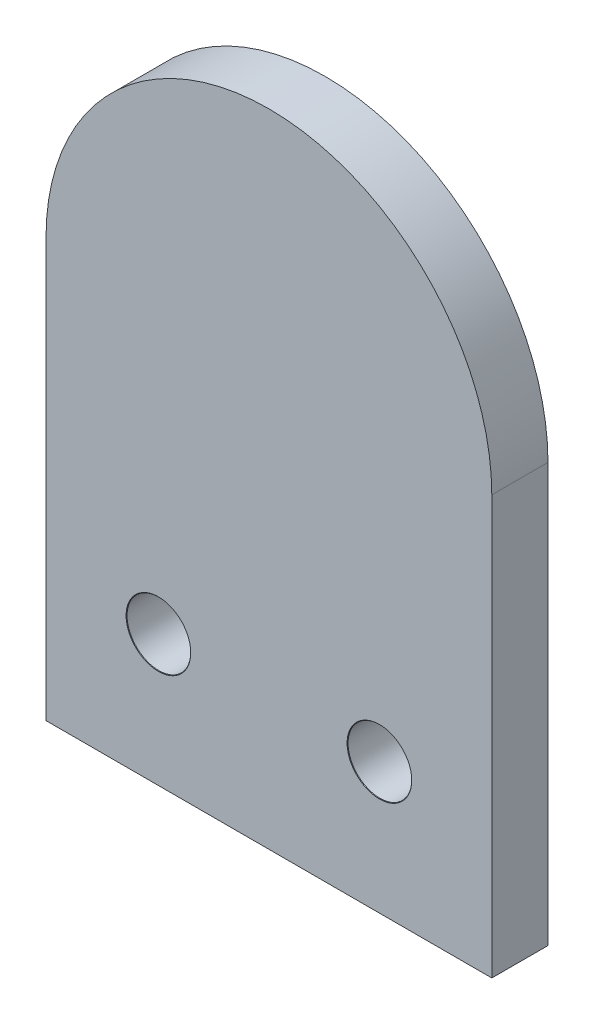
ISO-10303-21;
HEADER;
FILE_DESCRIPTION(('STEP AP214'),'2;1');
FILE_NAME('part.step','',(''),(''),'','','');
FILE_SCHEMA(('AUTOMOTIVE_DESIGN { 1 0 10303 214 1 1 1 1 }'));
ENDSEC;
DATA;
#1=APPLICATION_CONTEXT('core data for automotive mechanical design processes');
#2=APPLICATION_PROTOCOL_DEFINITION('international standard','automotive_design',2000,#1);
#3=PRODUCT_CONTEXT('',#1,'mechanical');
#4=PRODUCT('Part','Part','',(#3));
#5=PRODUCT_RELATED_PRODUCT_CATEGORY('part','',(#4));
#6=PRODUCT_DEFINITION_FORMATION('','',#4);
#7=PRODUCT_DEFINITION_CONTEXT('part definition',#1,'design');
#8=PRODUCT_DEFINITION('design','',#6,#7);
#9=PRODUCT_DEFINITION_SHAPE('','',#8);
#10=(LENGTH_UNIT() NAMED_UNIT(*) SI_UNIT(.MILLI.,.METRE.));
#11=(NAMED_UNIT(*) PLANE_ANGLE_UNIT() SI_UNIT($,.RADIAN.));
#12=(NAMED_UNIT(*) SI_UNIT($,.STERADIAN.) SOLID_ANGLE_UNIT());
#13=UNCERTAINTY_MEASURE_WITH_UNIT(LENGTH_MEASURE(1.E-05),#10,'distance_accuracy_value','');
#14=(GEOMETRIC_REPRESENTATION_CONTEXT(3) GLOBAL_UNCERTAINTY_ASSIGNED_CONTEXT((#13)) GLOBAL_UNIT_ASSIGNED_CONTEXT((#10,
#11,#12)) REPRESENTATION_CONTEXT('',''));
#15=CARTESIAN_POINT('',(0.,0.,0.));
#16=DIRECTION('',(0.,0.,1.));
#17=DIRECTION('',(1.,0.,0.));
#18=AXIS2_PLACEMENT_3D('',#15,#16,#17);
#19=CARTESIAN_POINT('',(0.,0.,3.));
#20=DIRECTION('',(0.,0.,-1.));
#21=DIRECTION('',(-1.,0.,0.));
#22=AXIS2_PLACEMENT_3D('',#19,#20,#21);
#23=CYLINDRICAL_SURFACE('',#22,11.9);
#24=CARTESIAN_POINT('',(0.,0.,0.));
#25=DIRECTION('',(0.,0.,1.));
#26=DIRECTION('',(1.,0.,0.));
#27=AXIS2_PLACEMENT_3D('',#24,#25,#26);
#28=CIRCLE('',#27,11.9);
#29=CARTESIAN_POINT('',(11.9,0.,0.));
#30=VERTEX_POINT('',#29);
#31=CARTESIAN_POINT('',(-11.9,0.,0.));
#32=VERTEX_POINT('',#31);
#33=EDGE_CURVE('E106',#30,#32,#28,.T.);
#34=ORIENTED_EDGE('',*,*,#33,.T.);
#35=DIRECTION('',(0.,0.,-1.));
#36=VECTOR('',#35,1.);
#37=CARTESIAN_POINT('',(-11.9,0.,3.));
#38=LINE('',#37,#36);
#39=CARTESIAN_POINT('',(-11.9,0.,3.));
#40=VERTEX_POINT('',#39);
#41=EDGE_CURVE('E97',#40,#32,#38,.T.);
#42=ORIENTED_EDGE('',*,*,#41,.F.);
#43=CARTESIAN_POINT('',(0.,0.,3.));
#44=DIRECTION('',(0.,0.,1.));
#45=DIRECTION('',(1.,0.,0.));
#46=AXIS2_PLACEMENT_3D('',#43,#44,#45);
#47=CIRCLE('',#46,11.9);
#48=CARTESIAN_POINT('',(11.9,0.,3.));
#49=VERTEX_POINT('',#48);
#50=EDGE_CURVE('E91',#49,#40,#47,.T.);
#51=ORIENTED_EDGE('',*,*,#50,.F.);
#52=DIRECTION('',(0.,0.,-1.));
#53=VECTOR('',#52,1.);
#54=CARTESIAN_POINT('',(11.9,0.,3.));
#55=LINE('',#54,#53);
#56=EDGE_CURVE('E102',#49,#30,#55,.T.);
#57=ORIENTED_EDGE('',*,*,#56,.T.);
#58=EDGE_LOOP('',(#34,#42,#51,#57));
#59=FACE_BOUND('',#58,.T.);
#60=ADVANCED_FACE('F37',(#59),#23,.T.);
#61=CARTESIAN_POINT('',(-11.9,0.,3.));
#62=DIRECTION('',(1.,0.,0.));
#63=DIRECTION('',(0.,0.,-1.));
#64=AXIS2_PLACEMENT_3D('',#61,#62,#63);
#65=PLANE('',#64);
#66=DIRECTION('',(0.,-1.,0.));
#67=VECTOR('',#66,1.);
#68=CARTESIAN_POINT('',(-11.9,0.,0.));
#69=LINE('',#68,#67);
#70=CARTESIAN_POINT('',(-11.9,-22.34,0.));
#71=VERTEX_POINT('',#70);
#72=EDGE_CURVE('E96',#32,#71,#69,.T.);
#73=ORIENTED_EDGE('',*,*,#72,.T.);
#74=DIRECTION('',(0.,0.,-1.));
#75=VECTOR('',#74,1.);
#76=CARTESIAN_POINT('',(-11.9,-22.34,3.));
#77=LINE('',#76,#75);
#78=CARTESIAN_POINT('',(-11.9,-22.34,3.));
#79=VERTEX_POINT('',#78);
#80=EDGE_CURVE('E94',#79,#71,#77,.T.);
#81=ORIENTED_EDGE('',*,*,#80,.F.);
#82=DIRECTION('',(0.,-1.,0.));
#83=VECTOR('',#82,1.);
#84=CARTESIAN_POINT('',(-11.9,0.,3.));
#85=LINE('',#84,#83);
#86=EDGE_CURVE('E86',#40,#79,#85,.T.);
#87=ORIENTED_EDGE('',*,*,#86,.F.);
#88=ORIENTED_EDGE('',*,*,#41,.T.);
#89=EDGE_LOOP('',(#73,#81,#87,#88));
#90=FACE_BOUND('',#89,.T.);
#91=ADVANCED_FACE('F95',(#90),#65,.F.);
#92=CARTESIAN_POINT('',(-11.9,-22.34,3.));
#93=DIRECTION('',(0.,1.,0.));
#94=DIRECTION('',(0.,0.,1.));
#95=AXIS2_PLACEMENT_3D('',#92,#93,#94);
#96=PLANE('',#95);
#97=DIRECTION('',(1.,0.,0.));
#98=VECTOR('',#97,1.);
#99=CARTESIAN_POINT('',(-11.9,-22.34,0.));
#100=LINE('',#99,#98);
#101=CARTESIAN_POINT('',(11.9,-22.34,0.));
#102=VERTEX_POINT('',#101);
#103=EDGE_CURVE('E72',#71,#102,#100,.T.);
#104=ORIENTED_EDGE('',*,*,#103,.T.);
#105=DIRECTION('',(0.,0.,-1.));
#106=VECTOR('',#105,1.);
#107=CARTESIAN_POINT('',(11.9,-22.34,3.));
#108=LINE('',#107,#106);
#109=CARTESIAN_POINT('',(11.9,-22.34,3.));
#110=VERTEX_POINT('',#109);
#111=EDGE_CURVE('E98',#110,#102,#108,.T.);
#112=ORIENTED_EDGE('',*,*,#111,.F.);
#113=DIRECTION('',(1.,0.,0.));
#114=VECTOR('',#113,1.);
#115=CARTESIAN_POINT('',(-11.9,-22.34,3.));
#116=LINE('',#115,#114);
#117=EDGE_CURVE('E89',#79,#110,#116,.T.);
#118=ORIENTED_EDGE('',*,*,#117,.F.);
#119=ORIENTED_EDGE('',*,*,#80,.T.);
#120=EDGE_LOOP('',(#104,#112,#118,#119));
#121=FACE_BOUND('',#120,.T.);
#122=ADVANCED_FACE('F100',(#121),#96,.F.);
#123=CARTESIAN_POINT('',(11.9,-22.34,3.));
#124=DIRECTION('',(-1.,0.,0.));
#125=DIRECTION('',(0.,0.,1.));
#126=AXIS2_PLACEMENT_3D('',#123,#124,#125);
#127=PLANE('',#126);
#128=DIRECTION('',(0.,1.,0.));
#129=VECTOR('',#128,1.);
#130=CARTESIAN_POINT('',(11.9,-22.34,0.));
#131=LINE('',#130,#129);
#132=EDGE_CURVE('E78',#102,#30,#131,.T.);
#133=ORIENTED_EDGE('',*,*,#132,.T.);
#134=ORIENTED_EDGE('',*,*,#56,.F.);
#135=DIRECTION('',(0.,1.,0.));
#136=VECTOR('',#135,1.);
#137=CARTESIAN_POINT('',(11.9,-22.34,3.));
#138=LINE('',#137,#136);
#139=EDGE_CURVE('E55',#110,#49,#138,.T.);
#140=ORIENTED_EDGE('',*,*,#139,.F.);
#141=ORIENTED_EDGE('',*,*,#111,.T.);
#142=EDGE_LOOP('',(#133,#134,#140,#141));
#143=FACE_BOUND('',#142,.T.);
#144=ADVANCED_FACE('F164',(#143),#127,.F.);
#145=CARTESIAN_POINT('',(0.,0.,3.));
#146=DIRECTION('',(0.,0.,1.));
#147=DIRECTION('',(1.,0.,0.));
#148=AXIS2_PLACEMENT_3D('',#145,#146,#147);
#149=PLANE('',#148);
#150=CARTESIAN_POINT('',(-5.9,-15.34,3.));
#151=DIRECTION('',(0.,0.,1.));
#152=DIRECTION('',(1.,0.,0.));
#153=AXIS2_PLACEMENT_3D('',#150,#151,#152);
#154=CIRCLE('',#153,1.725);
#155=CARTESIAN_POINT('',(-4.175,-15.34,3.));
#156=VERTEX_POINT('',#155);
#157=EDGE_CURVE('E365',#156,#156,#154,.T.);
#158=ORIENTED_EDGE('',*,*,#157,.F.);
#159=EDGE_LOOP('',(#158));
#160=FACE_BOUND('',#159,.T.);
#161=CARTESIAN_POINT('',(5.9,-15.34,3.));
#162=DIRECTION('',(0.,0.,1.));
#163=DIRECTION('',(1.,0.,0.));
#164=AXIS2_PLACEMENT_3D('',#161,#162,#163);
#165=CIRCLE('',#164,1.725);
#166=CARTESIAN_POINT('',(7.625,-15.34,3.));
#167=VERTEX_POINT('',#166);
#168=EDGE_CURVE('E133',#167,#167,#165,.T.);
#169=ORIENTED_EDGE('',*,*,#168,.F.);
#170=EDGE_LOOP('',(#169));
#171=FACE_BOUND('',#170,.T.);
#172=ORIENTED_EDGE('',*,*,#50,.T.);
#173=ORIENTED_EDGE('',*,*,#86,.T.);
#174=ORIENTED_EDGE('',*,*,#117,.T.);
#175=ORIENTED_EDGE('',*,*,#139,.T.);
#176=EDGE_LOOP('',(#172,#173,#174,#175));
#177=FACE_BOUND('',#176,.T.);
#178=ADVANCED_FACE('F87',(#160,#171,#177),#149,.T.);
#179=CARTESIAN_POINT('',(0.,0.,0.));
#180=DIRECTION('',(0.,0.,1.));
#181=DIRECTION('',(1.,0.,0.));
#182=AXIS2_PLACEMENT_3D('',#179,#180,#181);
#183=PLANE('',#182);
#184=CARTESIAN_POINT('',(-5.9,-15.34,0.));
#185=DIRECTION('',(0.,0.,1.));
#186=DIRECTION('',(1.,0.,0.));
#187=AXIS2_PLACEMENT_3D('',#184,#185,#186);
#188=CIRCLE('',#187,1.7);
#189=CARTESIAN_POINT('',(-4.2,-15.34,0.));
#190=VERTEX_POINT('',#189);
#191=EDGE_CURVE('E40',#190,#190,#188,.T.);
#192=ORIENTED_EDGE('',*,*,#191,.T.);
#193=EDGE_LOOP('',(#192));
#194=FACE_BOUND('',#193,.T.);
#195=CARTESIAN_POINT('',(5.9,-15.34,0.));
#196=DIRECTION('',(0.,0.,1.));
#197=DIRECTION('',(1.,0.,0.));
#198=AXIS2_PLACEMENT_3D('',#195,#196,#197);
#199=CIRCLE('',#198,1.7);
#200=CARTESIAN_POINT('',(7.6,-15.34,0.));
#201=VERTEX_POINT('',#200);
#202=EDGE_CURVE('E123',#201,#201,#199,.T.);
#203=ORIENTED_EDGE('',*,*,#202,.T.);
#204=EDGE_LOOP('',(#203));
#205=FACE_BOUND('',#204,.T.);
#206=CARTESIAN_POINT('',(6.,0.,0.));
#207=DIRECTION('',(0.,0.,1.));
#208=DIRECTION('',(1.,0.,0.));
#209=AXIS2_PLACEMENT_3D('',#206,#207,#208);
#210=CIRCLE('',#209,1.95);
#211=CARTESIAN_POINT('',(7.95,0.,0.));
#212=VERTEX_POINT('',#211);
#213=EDGE_CURVE('E11',#212,#212,#210,.F.);
#214=ORIENTED_EDGE('',*,*,#213,.F.);
#215=EDGE_LOOP('',(#214));
#216=FACE_BOUND('',#215,.T.);
#217=CARTESIAN_POINT('',(-1.68325892343959E-13,-6.,0.));
#218=DIRECTION('',(0.,0.,1.));
#219=DIRECTION('',(1.,0.,0.));
#220=AXIS2_PLACEMENT_3D('',#217,#218,#219);
#221=CIRCLE('',#220,1.9500000000002);
#222=CARTESIAN_POINT('',(1.95000000000003,-6.,0.));
#223=VERTEX_POINT('',#222);
#224=EDGE_CURVE('E46',#223,#223,#221,.F.);
#225=ORIENTED_EDGE('',*,*,#224,.F.);
#226=EDGE_LOOP('',(#225));
#227=FACE_BOUND('',#226,.T.);
#228=CARTESIAN_POINT('',(-6.,0.,0.));
#229=DIRECTION('',(0.,0.,1.));
#230=DIRECTION('',(1.,0.,0.));
#231=AXIS2_PLACEMENT_3D('',#228,#229,#230);
#232=CIRCLE('',#231,1.95);
#233=CARTESIAN_POINT('',(-4.05,0.,0.));
#234=VERTEX_POINT('',#233);
#235=EDGE_CURVE('E119',#234,#234,#232,.F.);
#236=ORIENTED_EDGE('',*,*,#235,.F.);
#237=EDGE_LOOP('',(#236));
#238=FACE_BOUND('',#237,.T.);
#239=CARTESIAN_POINT('',(0.,6.,0.));
#240=DIRECTION('',(0.,0.,1.));
#241=DIRECTION('',(1.,0.,0.));
#242=AXIS2_PLACEMENT_3D('',#239,#240,#241);
#243=CIRCLE('',#242,1.95);
#244=CARTESIAN_POINT('',(1.95,6.,0.));
#245=VERTEX_POINT('',#244);
#246=EDGE_CURVE('E116',#245,#245,#243,.F.);
#247=ORIENTED_EDGE('',*,*,#246,.F.);
#248=EDGE_LOOP('',(#247));
#249=FACE_BOUND('',#248,.T.);
#250=ORIENTED_EDGE('',*,*,#33,.F.);
#251=ORIENTED_EDGE('',*,*,#132,.F.);
#252=ORIENTED_EDGE('',*,*,#103,.F.);
#253=ORIENTED_EDGE('',*,*,#72,.F.);
#254=EDGE_LOOP('',(#250,#251,#252,#253));
#255=FACE_BOUND('',#254,.T.);
#256=ADVANCED_FACE('F154',(#194,#205,#216,#227,#238,#249,#255),#183,.F.);
#257=CARTESIAN_POINT('',(0.,6.,-3.));
#258=DIRECTION('',(0.,0.,1.));
#259=DIRECTION('',(1.,0.,0.));
#260=AXIS2_PLACEMENT_3D('',#257,#258,#259);
#261=CYLINDRICAL_SURFACE('',#260,1.95);
#262=CARTESIAN_POINT('',(0.,6.,-3.));
#263=DIRECTION('',(0.,0.,-1.));
#264=DIRECTION('',(-1.,0.,0.));
#265=AXIS2_PLACEMENT_3D('',#262,#263,#264);
#266=CIRCLE('',#265,1.95);
#267=CARTESIAN_POINT('',(-1.95,6.,-3.));
#268=VERTEX_POINT('',#267);
#269=EDGE_CURVE('E109',#268,#268,#266,.T.);
#270=ORIENTED_EDGE('',*,*,#269,.F.);
#271=EDGE_LOOP('',(#270));
#272=FACE_BOUND('',#271,.T.);
#273=ORIENTED_EDGE('',*,*,#246,.T.);
#274=EDGE_LOOP('',(#273));
#275=FACE_BOUND('',#274,.T.);
#276=ADVANCED_FACE('F151',(#272,#275),#261,.T.);
#277=CARTESIAN_POINT('',(0.,6.,-3.));
#278=DIRECTION('',(0.,0.,-1.));
#279=DIRECTION('',(-1.,0.,0.));
#280=AXIS2_PLACEMENT_3D('',#277,#278,#279);
#281=PLANE('',#280);
#282=ORIENTED_EDGE('',*,*,#269,.T.);
#283=EDGE_LOOP('',(#282));
#284=FACE_BOUND('',#283,.T.);
#285=ADVANCED_FACE('F149',(#284),#281,.T.);
#286=CARTESIAN_POINT('',(-6.,0.,-3.));
#287=DIRECTION('',(0.,0.,1.));
#288=DIRECTION('',(1.,0.,0.));
#289=AXIS2_PLACEMENT_3D('',#286,#287,#288);
#290=CYLINDRICAL_SURFACE('',#289,1.95);
#291=CARTESIAN_POINT('',(-6.,0.,-3.));
#292=DIRECTION('',(0.,0.,-1.));
#293=DIRECTION('',(-1.,0.,0.));
#294=AXIS2_PLACEMENT_3D('',#291,#292,#293);
#295=CIRCLE('',#294,1.95);
#296=CARTESIAN_POINT('',(-7.95,0.,-3.));
#297=VERTEX_POINT('',#296);
#298=EDGE_CURVE('E143',#297,#297,#295,.T.);
#299=ORIENTED_EDGE('',*,*,#298,.F.);
#300=EDGE_LOOP('',(#299));
#301=FACE_BOUND('',#300,.T.);
#302=ORIENTED_EDGE('',*,*,#235,.T.);
#303=EDGE_LOOP('',(#302));
#304=FACE_BOUND('',#303,.T.);
#305=ADVANCED_FACE('F208',(#301,#304),#290,.T.);
#306=CARTESIAN_POINT('',(-6.,0.,-3.));
#307=DIRECTION('',(0.,0.,-1.));
#308=DIRECTION('',(-1.,0.,0.));
#309=AXIS2_PLACEMENT_3D('',#306,#307,#308);
#310=PLANE('',#309);
#311=ORIENTED_EDGE('',*,*,#298,.T.);
#312=EDGE_LOOP('',(#311));
#313=FACE_BOUND('',#312,.T.);
#314=ADVANCED_FACE('F218',(#313),#310,.T.);
#315=CARTESIAN_POINT('',(-1.68325892343959E-13,-6.,-3.));
#316=DIRECTION('',(0.,0.,1.));
#317=DIRECTION('',(1.,0.,0.));
#318=AXIS2_PLACEMENT_3D('',#315,#316,#317);
#319=CYLINDRICAL_SURFACE('',#318,1.9500000000002);
#320=CARTESIAN_POINT('',(-1.68325892343959E-13,-6.,-3.));
#321=DIRECTION('',(0.,0.,-1.));
#322=DIRECTION('',(-1.,0.,0.));
#323=AXIS2_PLACEMENT_3D('',#320,#321,#322);
#324=CIRCLE('',#323,1.9500000000002);
#325=CARTESIAN_POINT('',(-1.95000000000037,-6.,-3.));
#326=VERTEX_POINT('',#325);
#327=EDGE_CURVE('E130',#326,#326,#324,.T.);
#328=ORIENTED_EDGE('',*,*,#327,.F.);
#329=EDGE_LOOP('',(#328));
#330=FACE_BOUND('',#329,.T.);
#331=ORIENTED_EDGE('',*,*,#224,.T.);
#332=EDGE_LOOP('',(#331));
#333=FACE_BOUND('',#332,.T.);
#334=ADVANCED_FACE('F229',(#330,#333),#319,.T.);
#335=CARTESIAN_POINT('',(-1.68325892343959E-13,-6.,-3.));
#336=DIRECTION('',(0.,0.,-1.));
#337=DIRECTION('',(-1.,0.,0.));
#338=AXIS2_PLACEMENT_3D('',#335,#336,#337);
#339=PLANE('',#338);
#340=ORIENTED_EDGE('',*,*,#327,.T.);
#341=EDGE_LOOP('',(#340));
#342=FACE_BOUND('',#341,.T.);
#343=ADVANCED_FACE('F240',(#342),#339,.T.);
#344=CARTESIAN_POINT('',(6.,0.,-3.));
#345=DIRECTION('',(0.,0.,1.));
#346=DIRECTION('',(1.,0.,0.));
#347=AXIS2_PLACEMENT_3D('',#344,#345,#346);
#348=CYLINDRICAL_SURFACE('',#347,1.95);
#349=CARTESIAN_POINT('',(6.,0.,-3.));
#350=DIRECTION('',(0.,0.,-1.));
#351=DIRECTION('',(-1.,0.,0.));
#352=AXIS2_PLACEMENT_3D('',#349,#350,#351);
#353=CIRCLE('',#352,1.95);
#354=CARTESIAN_POINT('',(4.05,0.,-3.));
#355=VERTEX_POINT('',#354);
#356=EDGE_CURVE('E125',#355,#355,#353,.T.);
#357=ORIENTED_EDGE('',*,*,#356,.F.);
#358=EDGE_LOOP('',(#357));
#359=FACE_BOUND('',#358,.T.);
#360=ORIENTED_EDGE('',*,*,#213,.T.);
#361=EDGE_LOOP('',(#360));
#362=FACE_BOUND('',#361,.T.);
#363=ADVANCED_FACE('F251',(#359,#362),#348,.T.);
#364=CARTESIAN_POINT('',(6.,0.,-3.));
#365=DIRECTION('',(0.,0.,-1.));
#366=DIRECTION('',(-1.,0.,0.));
#367=AXIS2_PLACEMENT_3D('',#364,#365,#366);
#368=PLANE('',#367);
#369=ORIENTED_EDGE('',*,*,#356,.T.);
#370=EDGE_LOOP('',(#369));
#371=FACE_BOUND('',#370,.T.);
#372=ADVANCED_FACE('F262',(#371),#368,.T.);
#373=CARTESIAN_POINT('',(5.9,-15.34,3.));
#374=DIRECTION('',(0.,0.,1.));
#375=DIRECTION('',(1.,0.,0.));
#376=AXIS2_PLACEMENT_3D('',#373,#374,#375);
#377=CYLINDRICAL_SURFACE('',#376,1.7);
#378=CARTESIAN_POINT('',(5.9,-15.34,2.975));
#379=DIRECTION('',(0.,0.,1.));
#380=DIRECTION('',(1.,0.,0.));
#381=AXIS2_PLACEMENT_3D('',#378,#379,#380);
#382=CIRCLE('',#381,1.7);
#383=CARTESIAN_POINT('',(7.6,-15.34,2.975));
#384=VERTEX_POINT('',#383);
#385=EDGE_CURVE('E126',#384,#384,#382,.T.);
#386=ORIENTED_EDGE('',*,*,#385,.T.);
#387=EDGE_LOOP('',(#386));
#388=FACE_BOUND('',#387,.T.);
#389=ORIENTED_EDGE('',*,*,#202,.F.);
#390=EDGE_LOOP('',(#389));
#391=FACE_BOUND('',#390,.T.);
#392=ADVANCED_FACE('F273',(#388,#391),#377,.F.);
#393=CARTESIAN_POINT('',(5.9,-15.34,3.));
#394=DIRECTION('',(0.,0.,1.));
#395=DIRECTION('',(1.,0.,0.));
#396=AXIS2_PLACEMENT_3D('',#393,#394,#395);
#397=CONICAL_SURFACE('',#396,1.725,0.785398163397431);
#398=ORIENTED_EDGE('',*,*,#385,.F.);
#399=EDGE_LOOP('',(#398));
#400=FACE_BOUND('',#399,.T.);
#401=ORIENTED_EDGE('',*,*,#168,.T.);
#402=EDGE_LOOP('',(#401));
#403=FACE_BOUND('',#402,.T.);
#404=ADVANCED_FACE('F296',(#400,#403),#397,.F.);
#405=CARTESIAN_POINT('',(-5.9,-15.34,3.));
#406=DIRECTION('',(0.,0.,1.));
#407=DIRECTION('',(1.,0.,0.));
#408=AXIS2_PLACEMENT_3D('',#405,#406,#407);
#409=CYLINDRICAL_SURFACE('',#408,1.7);
#410=CARTESIAN_POINT('',(-5.9,-15.34,2.975));
#411=DIRECTION('',(0.,0.,1.));
#412=DIRECTION('',(1.,0.,0.));
#413=AXIS2_PLACEMENT_3D('',#410,#411,#412);
#414=CIRCLE('',#413,1.7);
#415=CARTESIAN_POINT('',(-4.2,-15.34,2.975));
#416=VERTEX_POINT('',#415);
#417=EDGE_CURVE('E362',#416,#416,#414,.T.);
#418=ORIENTED_EDGE('',*,*,#417,.T.);
#419=EDGE_LOOP('',(#418));
#420=FACE_BOUND('',#419,.T.);
#421=ORIENTED_EDGE('',*,*,#191,.F.);
#422=EDGE_LOOP('',(#421));
#423=FACE_BOUND('',#422,.T.);
#424=ADVANCED_FACE('F306',(#420,#423),#409,.F.);
#425=CARTESIAN_POINT('',(-5.9,-15.34,3.));
#426=DIRECTION('',(0.,0.,1.));
#427=DIRECTION('',(1.,0.,0.));
#428=AXIS2_PLACEMENT_3D('',#425,#426,#427);
#429=CONICAL_SURFACE('',#428,1.725,0.785398163397431);
#430=ORIENTED_EDGE('',*,*,#417,.F.);
#431=EDGE_LOOP('',(#430));
#432=FACE_BOUND('',#431,.T.);
#433=ORIENTED_EDGE('',*,*,#157,.T.);
#434=EDGE_LOOP('',(#433));
#435=FACE_BOUND('',#434,.T.);
#436=ADVANCED_FACE('F317',(#432,#435),#429,.F.);
#437=CLOSED_SHELL('',(#60,#91,#122,#144,#178,#256,#276,#285,#305,#314,#334,#343,#363,#372,#392,
#404,#424,#436));
#438=MANIFOLD_SOLID_BREP('B2',#437);
#439=ADVANCED_BREP_SHAPE_REPRESENTATION('',(#18,#438),#14);
#440=SHAPE_DEFINITION_REPRESENTATION(#9,#439);
ENDSEC;
END-ISO-10303-21;
